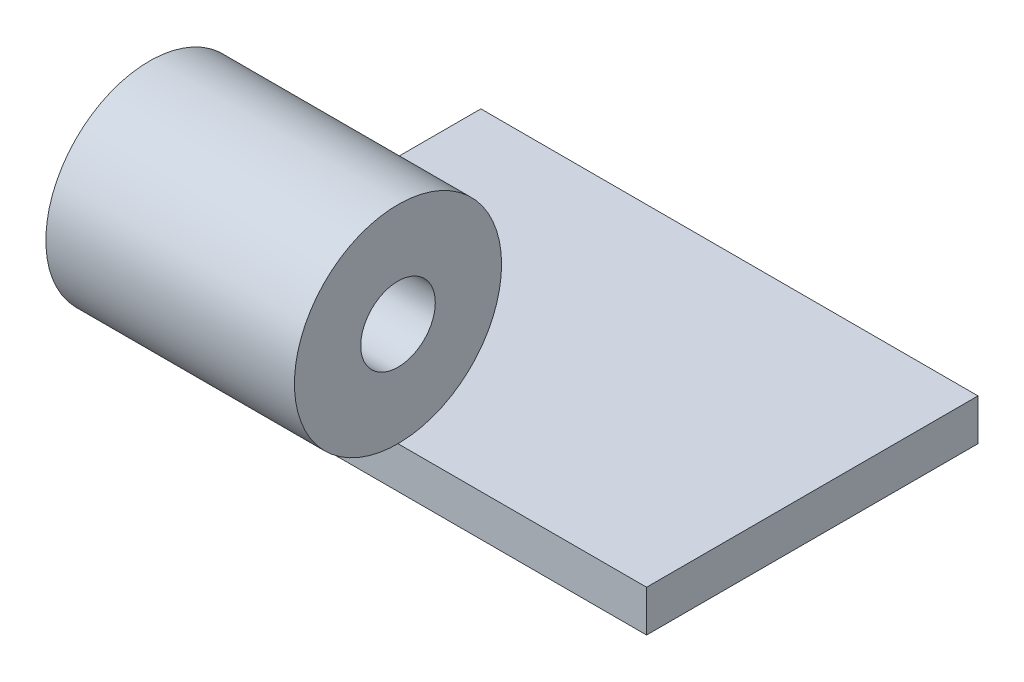
ISO-10303-21;
HEADER;
FILE_DESCRIPTION(('STEP AP214'),'2;1');
FILE_NAME('part.step','',(''),(''),'','','');
FILE_SCHEMA(('AUTOMOTIVE_DESIGN { 1 0 10303 214 1 1 1 1 }'));
ENDSEC;
DATA;
#1=APPLICATION_CONTEXT('core data for automotive mechanical design processes');
#2=APPLICATION_PROTOCOL_DEFINITION('international standard','automotive_design',2000,#1);
#3=PRODUCT_CONTEXT('',#1,'mechanical');
#4=PRODUCT('Part','Part','',(#3));
#5=PRODUCT_RELATED_PRODUCT_CATEGORY('part','',(#4));
#6=PRODUCT_DEFINITION_FORMATION('','',#4);
#7=PRODUCT_DEFINITION_CONTEXT('part definition',#1,'design');
#8=PRODUCT_DEFINITION('design','',#6,#7);
#9=PRODUCT_DEFINITION_SHAPE('','',#8);
#10=(LENGTH_UNIT() NAMED_UNIT(*) SI_UNIT(.MILLI.,.METRE.));
#11=(NAMED_UNIT(*) PLANE_ANGLE_UNIT() SI_UNIT($,.RADIAN.));
#12=(NAMED_UNIT(*) SI_UNIT($,.STERADIAN.) SOLID_ANGLE_UNIT());
#13=UNCERTAINTY_MEASURE_WITH_UNIT(LENGTH_MEASURE(1.E-05),#10,'distance_accuracy_value','');
#14=(GEOMETRIC_REPRESENTATION_CONTEXT(3) GLOBAL_UNCERTAINTY_ASSIGNED_CONTEXT((#13)) GLOBAL_UNIT_ASSIGNED_CONTEXT((#10,
#11,#12)) REPRESENTATION_CONTEXT('',''));
#15=CARTESIAN_POINT('',(0.,0.,0.));
#16=DIRECTION('',(0.,0.,1.));
#17=DIRECTION('',(1.,0.,0.));
#18=AXIS2_PLACEMENT_3D('',#15,#16,#17);
#19=CARTESIAN_POINT('',(-30.,12.5,20.));
#20=DIRECTION('',(1.,0.,0.));
#21=DIRECTION('',(0.,0.,-1.));
#22=AXIS2_PLACEMENT_3D('',#19,#20,#21);
#23=CYLINDRICAL_SURFACE('',#22,12.5);
#24=CARTESIAN_POINT('',(0.,12.5,20.));
#25=DIRECTION('',(1.,0.,0.));
#26=DIRECTION('',(0.,0.,-1.));
#27=AXIS2_PLACEMENT_3D('',#24,#25,#26);
#28=CIRCLE('',#27,12.5);
#29=CARTESIAN_POINT('',(0.,12.5,7.49999999999999));
#30=VERTEX_POINT('',#29);
#31=EDGE_CURVE('E55',#30,#30,#28,.T.);
#32=ORIENTED_EDGE('',*,*,#31,.F.);
#33=EDGE_LOOP('',(#32));
#34=FACE_BOUND('',#33,.T.);
#35=CARTESIAN_POINT('',(-30.,12.5,20.));
#36=DIRECTION('',(1.,0.,0.));
#37=DIRECTION('',(0.,0.,-1.));
#38=AXIS2_PLACEMENT_3D('',#35,#36,#37);
#39=CIRCLE('',#38,12.5);
#40=CARTESIAN_POINT('',(-30.,12.5,7.49999999999999));
#41=VERTEX_POINT('',#40);
#42=EDGE_CURVE('E12',#41,#41,#39,.T.);
#43=ORIENTED_EDGE('',*,*,#42,.T.);
#44=EDGE_LOOP('',(#43));
#45=FACE_BOUND('',#44,.T.);
#46=ADVANCED_FACE('F48',(#34,#45),#23,.T.);
#47=CARTESIAN_POINT('',(-30.,12.5,20.));
#48=DIRECTION('',(1.,0.,0.));
#49=DIRECTION('',(0.,0.,-1.));
#50=AXIS2_PLACEMENT_3D('',#47,#48,#49);
#51=PLANE('',#50);
#52=ORIENTED_EDGE('',*,*,#42,.F.);
#53=EDGE_LOOP('',(#52));
#54=FACE_BOUND('',#53,.T.);
#55=ADVANCED_FACE('F79',(#54),#51,.F.);
#56=CARTESIAN_POINT('',(0.,12.5,20.));
#57=DIRECTION('',(1.,0.,0.));
#58=DIRECTION('',(0.,0.,-1.));
#59=AXIS2_PLACEMENT_3D('',#56,#57,#58);
#60=PLANE('',#59);
#61=CARTESIAN_POINT('',(0.,12.5,20.));
#62=DIRECTION('',(1.,0.,0.));
#63=DIRECTION('',(0.,0.,-1.));
#64=AXIS2_PLACEMENT_3D('',#61,#62,#63);
#65=CIRCLE('',#64,4.5);
#66=CARTESIAN_POINT('',(0.,12.5,15.5));
#67=VERTEX_POINT('',#66);
#68=EDGE_CURVE('E60',#67,#67,#65,.T.);
#69=ORIENTED_EDGE('',*,*,#68,.F.);
#70=EDGE_LOOP('',(#69));
#71=FACE_BOUND('',#70,.T.);
#72=ORIENTED_EDGE('',*,*,#31,.T.);
#73=EDGE_LOOP('',(#72));
#74=FACE_BOUND('',#73,.T.);
#75=ADVANCED_FACE('F76',(#71,#74),#60,.T.);
#76=CARTESIAN_POINT('',(-30.,12.5,20.));
#77=DIRECTION('',(1.,0.,0.));
#78=DIRECTION('',(0.,0.,-1.));
#79=AXIS2_PLACEMENT_3D('',#76,#77,#78);
#80=CYLINDRICAL_SURFACE('',#79,4.5);
#81=CARTESIAN_POINT('',(-25.,12.5,20.));
#82=DIRECTION('',(1.,0.,0.));
#83=DIRECTION('',(0.,0.,-1.));
#84=AXIS2_PLACEMENT_3D('',#81,#82,#83);
#85=CIRCLE('',#84,4.5);
#86=CARTESIAN_POINT('',(-25.,12.5,15.5));
#87=VERTEX_POINT('',#86);
#88=EDGE_CURVE('E51',#87,#87,#85,.F.);
#89=ORIENTED_EDGE('',*,*,#88,.T.);
#90=EDGE_LOOP('',(#89));
#91=FACE_BOUND('',#90,.T.);
#92=ORIENTED_EDGE('',*,*,#68,.T.);
#93=EDGE_LOOP('',(#92));
#94=FACE_BOUND('',#93,.T.);
#95=ADVANCED_FACE('F68',(#91,#94),#80,.F.);
#96=CARTESIAN_POINT('',(-25.,12.5,20.));
#97=DIRECTION('',(1.,0.,0.));
#98=DIRECTION('',(0.,0.,-1.));
#99=AXIS2_PLACEMENT_3D('',#96,#97,#98);
#100=PLANE('',#99);
#101=ORIENTED_EDGE('',*,*,#88,.F.);
#102=EDGE_LOOP('',(#101));
#103=FACE_BOUND('',#102,.T.);
#104=ADVANCED_FACE('F70',(#103),#100,.T.);
#105=CLOSED_SHELL('',(#46,#55,#75,#95,#104));
#106=MANIFOLD_SOLID_BREP('B2',#105);
#107=CARTESIAN_POINT('',(30.,-5.,20.));
#108=DIRECTION('',(0.,0.,-1.));
#109=DIRECTION('',(-1.,0.,0.));
#110=AXIS2_PLACEMENT_3D('',#107,#108,#109);
#111=PLANE('',#110);
#112=DIRECTION('',(0.,-1.,0.));
#113=VECTOR('',#112,1.);
#114=CARTESIAN_POINT('',(-30.,-5.,20.));
#115=LINE('',#114,#113);
#116=CARTESIAN_POINT('',(-30.,0.,20.));
#117=VERTEX_POINT('',#116);
#118=CARTESIAN_POINT('',(-30.,-5.,20.));
#119=VERTEX_POINT('',#118);
#120=EDGE_CURVE('E184',#117,#119,#115,.T.);
#121=ORIENTED_EDGE('',*,*,#120,.T.);
#122=DIRECTION('',(-1.,0.,0.));
#123=VECTOR('',#122,1.);
#124=CARTESIAN_POINT('',(30.,-5.,20.));
#125=LINE('',#124,#123);
#126=CARTESIAN_POINT('',(30.,-5.,20.));
#127=VERTEX_POINT('',#126);
#128=EDGE_CURVE('E46',#127,#119,#125,.T.);
#129=ORIENTED_EDGE('',*,*,#128,.F.);
#130=DIRECTION('',(0.,-1.,0.));
#131=VECTOR('',#130,1.);
#132=CARTESIAN_POINT('',(30.,-5.,20.));
#133=LINE('',#132,#131);
#134=CARTESIAN_POINT('',(30.,0.,20.));
#135=VERTEX_POINT('',#134);
#136=EDGE_CURVE('E172',#135,#127,#133,.T.);
#137=ORIENTED_EDGE('',*,*,#136,.F.);
#138=DIRECTION('',(-1.,0.,0.));
#139=VECTOR('',#138,1.);
#140=CARTESIAN_POINT('',(30.,0.,20.));
#141=LINE('',#140,#139);
#142=EDGE_CURVE('E180',#135,#117,#141,.T.);
#143=ORIENTED_EDGE('',*,*,#142,.T.);
#144=EDGE_LOOP('',(#121,#129,#137,#143));
#145=FACE_BOUND('',#144,.T.);
#146=ADVANCED_FACE('F121',(#145),#111,.F.);
#147=CARTESIAN_POINT('',(30.,-5.,-20.));
#148=DIRECTION('',(0.,1.,0.));
#149=DIRECTION('',(0.,0.,1.));
#150=AXIS2_PLACEMENT_3D('',#147,#148,#149);
#151=PLANE('',#150);
#152=DIRECTION('',(0.,0.,-1.));
#153=VECTOR('',#152,1.);
#154=CARTESIAN_POINT('',(-30.,-5.,-20.));
#155=LINE('',#154,#153);
#156=CARTESIAN_POINT('',(-30.,-5.,-20.));
#157=VERTEX_POINT('',#156);
#158=EDGE_CURVE('E176',#119,#157,#155,.T.);
#159=ORIENTED_EDGE('',*,*,#158,.T.);
#160=DIRECTION('',(-1.,0.,0.));
#161=VECTOR('',#160,1.);
#162=CARTESIAN_POINT('',(30.,-5.,-20.));
#163=LINE('',#162,#161);
#164=CARTESIAN_POINT('',(30.,-5.,-20.));
#165=VERTEX_POINT('',#164);
#166=EDGE_CURVE('E129',#165,#157,#163,.T.);
#167=ORIENTED_EDGE('',*,*,#166,.F.);
#168=DIRECTION('',(0.,0.,-1.));
#169=VECTOR('',#168,1.);
#170=CARTESIAN_POINT('',(30.,-5.,-20.));
#171=LINE('',#170,#169);
#172=EDGE_CURVE('E167',#127,#165,#171,.T.);
#173=ORIENTED_EDGE('',*,*,#172,.F.);
#174=ORIENTED_EDGE('',*,*,#128,.T.);
#175=EDGE_LOOP('',(#159,#167,#173,#174));
#176=FACE_BOUND('',#175,.T.);
#177=ADVANCED_FACE('F175',(#176),#151,.F.);
#178=CARTESIAN_POINT('',(30.,-5.,-20.));
#179=DIRECTION('',(0.,0.,1.));
#180=DIRECTION('',(0.,-1.,0.));
#181=AXIS2_PLACEMENT_3D('',#178,#179,#180);
#182=PLANE('',#181);
#183=DIRECTION('',(0.,1.,0.));
#184=VECTOR('',#183,1.);
#185=CARTESIAN_POINT('',(-30.,-5.,-20.));
#186=LINE('',#185,#184);
#187=CARTESIAN_POINT('',(-30.,0.,-20.));
#188=VERTEX_POINT('',#187);
#189=EDGE_CURVE('E154',#157,#188,#186,.T.);
#190=ORIENTED_EDGE('',*,*,#189,.T.);
#191=DIRECTION('',(-1.,0.,0.));
#192=VECTOR('',#191,1.);
#193=CARTESIAN_POINT('',(30.,0.,-20.));
#194=LINE('',#193,#192);
#195=CARTESIAN_POINT('',(30.,0.,-20.));
#196=VERTEX_POINT('',#195);
#197=EDGE_CURVE('E177',#196,#188,#194,.T.);
#198=ORIENTED_EDGE('',*,*,#197,.F.);
#199=DIRECTION('',(0.,1.,0.));
#200=VECTOR('',#199,1.);
#201=CARTESIAN_POINT('',(30.,-5.,-20.));
#202=LINE('',#201,#200);
#203=EDGE_CURVE('E170',#165,#196,#202,.T.);
#204=ORIENTED_EDGE('',*,*,#203,.F.);
#205=ORIENTED_EDGE('',*,*,#166,.T.);
#206=EDGE_LOOP('',(#190,#198,#204,#205));
#207=FACE_BOUND('',#206,.T.);
#208=ADVANCED_FACE('F178',(#207),#182,.F.);
#209=CARTESIAN_POINT('',(30.,0.,-20.));
#210=DIRECTION('',(0.,-1.,0.));
#211=DIRECTION('',(0.,0.,-1.));
#212=AXIS2_PLACEMENT_3D('',#209,#210,#211);
#213=PLANE('',#212);
#214=DIRECTION('',(0.,0.,1.));
#215=VECTOR('',#214,1.);
#216=CARTESIAN_POINT('',(-30.,0.,-20.));
#217=LINE('',#216,#215);
#218=EDGE_CURVE('E160',#188,#117,#217,.T.);
#219=ORIENTED_EDGE('',*,*,#218,.T.);
#220=ORIENTED_EDGE('',*,*,#142,.F.);
#221=DIRECTION('',(0.,0.,1.));
#222=VECTOR('',#221,1.);
#223=CARTESIAN_POINT('',(30.,0.,-20.));
#224=LINE('',#223,#222);
#225=EDGE_CURVE('E137',#196,#135,#224,.T.);
#226=ORIENTED_EDGE('',*,*,#225,.F.);
#227=ORIENTED_EDGE('',*,*,#197,.T.);
#228=EDGE_LOOP('',(#219,#220,#226,#227));
#229=FACE_BOUND('',#228,.T.);
#230=ADVANCED_FACE('F191',(#229),#213,.F.);
#231=CARTESIAN_POINT('',(30.,0.,0.));
#232=DIRECTION('',(1.,0.,0.));
#233=DIRECTION('',(0.,0.,-1.));
#234=AXIS2_PLACEMENT_3D('',#231,#232,#233);
#235=PLANE('',#234);
#236=ORIENTED_EDGE('',*,*,#136,.T.);
#237=ORIENTED_EDGE('',*,*,#172,.T.);
#238=ORIENTED_EDGE('',*,*,#203,.T.);
#239=ORIENTED_EDGE('',*,*,#225,.T.);
#240=EDGE_LOOP('',(#236,#237,#238,#239));
#241=FACE_BOUND('',#240,.T.);
#242=ADVANCED_FACE('F168',(#241),#235,.T.);
#243=CARTESIAN_POINT('',(-30.,0.,0.));
#244=DIRECTION('',(1.,0.,0.));
#245=DIRECTION('',(0.,0.,-1.));
#246=AXIS2_PLACEMENT_3D('',#243,#244,#245);
#247=PLANE('',#246);
#248=ORIENTED_EDGE('',*,*,#120,.F.);
#249=ORIENTED_EDGE('',*,*,#218,.F.);
#250=ORIENTED_EDGE('',*,*,#189,.F.);
#251=ORIENTED_EDGE('',*,*,#158,.F.);
#252=EDGE_LOOP('',(#248,#249,#250,#251));
#253=FACE_BOUND('',#252,.T.);
#254=ADVANCED_FACE('F194',(#253),#247,.F.);
#255=CLOSED_SHELL('',(#146,#177,#208,#230,#242,#254));
#256=MANIFOLD_SOLID_BREP('B7',#255);
#257=ADVANCED_BREP_SHAPE_REPRESENTATION('',(#18,#106,#256),#14);
#258=SHAPE_DEFINITION_REPRESENTATION(#9,#257);
ENDSEC;
END-ISO-10303-21;
